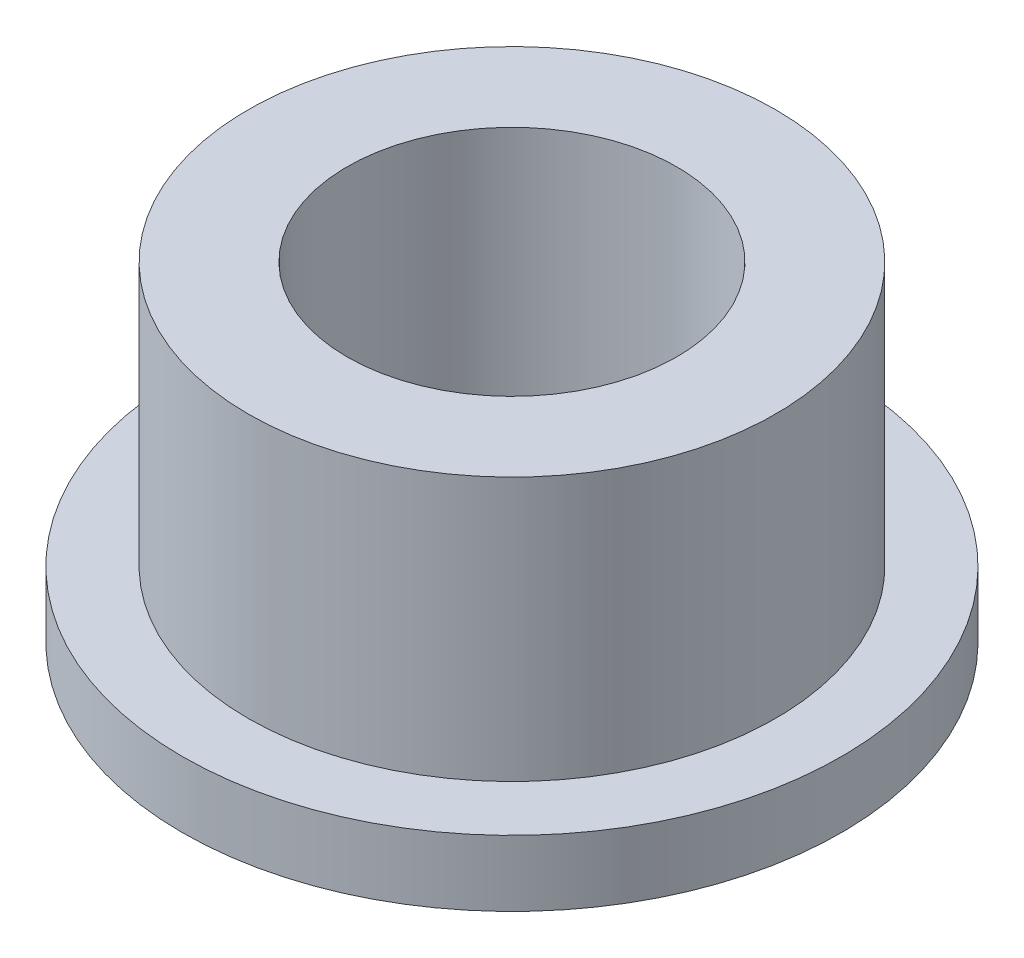
ISO-10303-21;
HEADER;
FILE_DESCRIPTION(('STEP AP214'),'2;1');
FILE_NAME('part.step','',(''),(''),'','','');
FILE_SCHEMA(('AUTOMOTIVE_DESIGN { 1 0 10303 214 1 1 1 1 }'));
ENDSEC;
DATA;
#1=APPLICATION_CONTEXT('core data for automotive mechanical design processes');
#2=APPLICATION_PROTOCOL_DEFINITION('international standard','automotive_design',2000,#1);
#3=PRODUCT_CONTEXT('',#1,'mechanical');
#4=PRODUCT('Part','Part','',(#3));
#5=PRODUCT_RELATED_PRODUCT_CATEGORY('part','',(#4));
#6=PRODUCT_DEFINITION_FORMATION('','',#4);
#7=PRODUCT_DEFINITION_CONTEXT('part definition',#1,'design');
#8=PRODUCT_DEFINITION('design','',#6,#7);
#9=PRODUCT_DEFINITION_SHAPE('','',#8);
#10=(LENGTH_UNIT() NAMED_UNIT(*) SI_UNIT(.MILLI.,.METRE.));
#11=(NAMED_UNIT(*) PLANE_ANGLE_UNIT() SI_UNIT($,.RADIAN.));
#12=(NAMED_UNIT(*) SI_UNIT($,.STERADIAN.) SOLID_ANGLE_UNIT());
#13=UNCERTAINTY_MEASURE_WITH_UNIT(LENGTH_MEASURE(1.E-05),#10,'distance_accuracy_value','');
#14=(GEOMETRIC_REPRESENTATION_CONTEXT(3) GLOBAL_UNCERTAINTY_ASSIGNED_CONTEXT((#13)) GLOBAL_UNIT_ASSIGNED_CONTEXT((#10,
#11,#12)) REPRESENTATION_CONTEXT('',''));
#15=CARTESIAN_POINT('',(0.,0.,0.));
#16=DIRECTION('',(0.,0.,1.));
#17=DIRECTION('',(1.,0.,0.));
#18=AXIS2_PLACEMENT_3D('',#15,#16,#17);
#19=CARTESIAN_POINT('',(0.,1.,0.));
#20=DIRECTION('',(0.,-1.,0.));
#21=DIRECTION('',(0.,0.,-1.));
#22=AXIS2_PLACEMENT_3D('',#19,#20,#21);
#23=CYLINDRICAL_SURFACE('',#22,5.);
#24=CARTESIAN_POINT('',(0.,1.,0.));
#25=DIRECTION('',(0.,1.,0.));
#26=DIRECTION('',(0.,0.,1.));
#27=AXIS2_PLACEMENT_3D('',#24,#25,#26);
#28=CIRCLE('',#27,5.);
#29=CARTESIAN_POINT('',(0.,1.,5.));
#30=VERTEX_POINT('',#29);
#31=EDGE_CURVE('E47',#30,#30,#28,.T.);
#32=ORIENTED_EDGE('',*,*,#31,.F.);
#33=EDGE_LOOP('',(#32));
#34=FACE_BOUND('',#33,.T.);
#35=CARTESIAN_POINT('',(0.,0.,0.));
#36=DIRECTION('',(0.,1.,0.));
#37=DIRECTION('',(0.,0.,1.));
#38=AXIS2_PLACEMENT_3D('',#35,#36,#37);
#39=CIRCLE('',#38,5.);
#40=CARTESIAN_POINT('',(0.,0.,5.));
#41=VERTEX_POINT('',#40);
#42=EDGE_CURVE('E52',#41,#41,#39,.T.);
#43=ORIENTED_EDGE('',*,*,#42,.T.);
#44=EDGE_LOOP('',(#43));
#45=FACE_BOUND('',#44,.T.);
#46=ADVANCED_FACE('F40',(#34,#45),#23,.T.);
#47=CARTESIAN_POINT('',(0.,1.,0.));
#48=DIRECTION('',(0.,1.,0.));
#49=DIRECTION('',(0.,0.,1.));
#50=AXIS2_PLACEMENT_3D('',#47,#48,#49);
#51=PLANE('',#50);
#52=CARTESIAN_POINT('',(0.,1.,0.));
#53=DIRECTION('',(0.,1.,0.));
#54=DIRECTION('',(0.,0.,1.));
#55=AXIS2_PLACEMENT_3D('',#52,#53,#54);
#56=CIRCLE('',#55,4.);
#57=CARTESIAN_POINT('',(0.,1.,4.));
#58=VERTEX_POINT('',#57);
#59=EDGE_CURVE('E10',#58,#58,#56,.T.);
#60=ORIENTED_EDGE('',*,*,#59,.F.);
#61=EDGE_LOOP('',(#60));
#62=FACE_BOUND('',#61,.T.);
#63=ORIENTED_EDGE('',*,*,#31,.T.);
#64=EDGE_LOOP('',(#63));
#65=FACE_BOUND('',#64,.T.);
#66=ADVANCED_FACE('F93',(#62,#65),#51,.T.);
#67=CARTESIAN_POINT('',(0.,0.,0.));
#68=DIRECTION('',(0.,1.,0.));
#69=DIRECTION('',(0.,0.,1.));
#70=AXIS2_PLACEMENT_3D('',#67,#68,#69);
#71=PLANE('',#70);
#72=CARTESIAN_POINT('',(0.,0.,0.));
#73=DIRECTION('',(0.,-1.,0.));
#74=DIRECTION('',(0.,0.,-1.));
#75=AXIS2_PLACEMENT_3D('',#72,#73,#74);
#76=CIRCLE('',#75,1.5);
#77=CARTESIAN_POINT('',(0.,0.,-1.5));
#78=VERTEX_POINT('',#77);
#79=EDGE_CURVE('E71',#78,#78,#76,.T.);
#80=ORIENTED_EDGE('',*,*,#79,.F.);
#81=EDGE_LOOP('',(#80));
#82=FACE_BOUND('',#81,.T.);
#83=ORIENTED_EDGE('',*,*,#42,.F.);
#84=EDGE_LOOP('',(#83));
#85=FACE_BOUND('',#84,.T.);
#86=ADVANCED_FACE('F98',(#82,#85),#71,.F.);
#87=CARTESIAN_POINT('',(0.,5.,0.));
#88=DIRECTION('',(0.,-1.,0.));
#89=DIRECTION('',(0.,0.,-1.));
#90=AXIS2_PLACEMENT_3D('',#87,#88,#89);
#91=CYLINDRICAL_SURFACE('',#90,4.);
#92=CARTESIAN_POINT('',(0.,5.,0.));
#93=DIRECTION('',(0.,1.,0.));
#94=DIRECTION('',(0.,0.,1.));
#95=AXIS2_PLACEMENT_3D('',#92,#93,#94);
#96=CIRCLE('',#95,4.);
#97=CARTESIAN_POINT('',(0.,5.,4.));
#98=VERTEX_POINT('',#97);
#99=EDGE_CURVE('E55',#98,#98,#96,.T.);
#100=ORIENTED_EDGE('',*,*,#99,.F.);
#101=EDGE_LOOP('',(#100));
#102=FACE_BOUND('',#101,.T.);
#103=ORIENTED_EDGE('',*,*,#59,.T.);
#104=EDGE_LOOP('',(#103));
#105=FACE_BOUND('',#104,.T.);
#106=ADVANCED_FACE('F106',(#102,#105),#91,.T.);
#107=CARTESIAN_POINT('',(0.,5.,0.));
#108=DIRECTION('',(0.,1.,0.));
#109=DIRECTION('',(0.,0.,1.));
#110=AXIS2_PLACEMENT_3D('',#107,#108,#109);
#111=PLANE('',#110);
#112=CARTESIAN_POINT('',(0.,5.,0.));
#113=DIRECTION('',(0.,1.,0.));
#114=DIRECTION('',(0.,0.,1.));
#115=AXIS2_PLACEMENT_3D('',#112,#113,#114);
#116=CIRCLE('',#115,2.5);
#117=CARTESIAN_POINT('',(0.,5.,2.5));
#118=VERTEX_POINT('',#117);
#119=EDGE_CURVE('E65',#118,#118,#116,.T.);
#120=ORIENTED_EDGE('',*,*,#119,.F.);
#121=EDGE_LOOP('',(#120));
#122=FACE_BOUND('',#121,.T.);
#123=ORIENTED_EDGE('',*,*,#99,.T.);
#124=EDGE_LOOP('',(#123));
#125=FACE_BOUND('',#124,.T.);
#126=ADVANCED_FACE('F89',(#122,#125),#111,.T.);
#127=CARTESIAN_POINT('',(0.,1.,0.));
#128=DIRECTION('',(0.,1.,0.));
#129=DIRECTION('',(0.,0.,1.));
#130=AXIS2_PLACEMENT_3D('',#127,#128,#129);
#131=CYLINDRICAL_SURFACE('',#130,2.5);
#132=CARTESIAN_POINT('',(0.,1.,0.));
#133=DIRECTION('',(0.,1.,0.));
#134=DIRECTION('',(0.,0.,1.));
#135=AXIS2_PLACEMENT_3D('',#132,#133,#134);
#136=CIRCLE('',#135,2.5);
#137=CARTESIAN_POINT('',(0.,1.,2.5));
#138=VERTEX_POINT('',#137);
#139=EDGE_CURVE('E61',#138,#138,#136,.T.);
#140=ORIENTED_EDGE('',*,*,#139,.F.);
#141=EDGE_LOOP('',(#140));
#142=FACE_BOUND('',#141,.T.);
#143=ORIENTED_EDGE('',*,*,#119,.T.);
#144=EDGE_LOOP('',(#143));
#145=FACE_BOUND('',#144,.T.);
#146=ADVANCED_FACE('F82',(#142,#145),#131,.F.);
#147=CARTESIAN_POINT('',(0.,1.,0.));
#148=DIRECTION('',(0.,1.,0.));
#149=DIRECTION('',(0.,0.,1.));
#150=AXIS2_PLACEMENT_3D('',#147,#148,#149);
#151=PLANE('',#150);
#152=CARTESIAN_POINT('',(0.,0.999999999999999,0.));
#153=DIRECTION('',(0.,1.,0.));
#154=DIRECTION('',(0.,0.,1.));
#155=AXIS2_PLACEMENT_3D('',#152,#153,#154);
#156=CIRCLE('',#155,1.5);
#157=CARTESIAN_POINT('',(0.,0.999999999999999,1.5));
#158=VERTEX_POINT('',#157);
#159=EDGE_CURVE('E43',#158,#158,#156,.T.);
#160=ORIENTED_EDGE('',*,*,#159,.F.);
#161=EDGE_LOOP('',(#160));
#162=FACE_BOUND('',#161,.T.);
#163=ORIENTED_EDGE('',*,*,#139,.T.);
#164=EDGE_LOOP('',(#163));
#165=FACE_BOUND('',#164,.T.);
#166=ADVANCED_FACE('F80',(#162,#165),#151,.T.);
#167=CARTESIAN_POINT('',(0.,10.,0.));
#168=DIRECTION('',(0.,-1.,0.));
#169=DIRECTION('',(0.,0.,-1.));
#170=AXIS2_PLACEMENT_3D('',#167,#168,#169);
#171=CYLINDRICAL_SURFACE('',#170,1.5);
#172=ORIENTED_EDGE('',*,*,#159,.T.);
#173=EDGE_LOOP('',(#172));
#174=FACE_BOUND('',#173,.T.);
#175=ORIENTED_EDGE('',*,*,#79,.T.);
#176=EDGE_LOOP('',(#175));
#177=FACE_BOUND('',#176,.T.);
#178=ADVANCED_FACE('F78',(#174,#177),#171,.F.);
#179=CLOSED_SHELL('',(#46,#66,#86,#106,#126,#146,#166,#178));
#180=MANIFOLD_SOLID_BREP('B2',#179);
#181=ADVANCED_BREP_SHAPE_REPRESENTATION('',(#18,#180),#14);
#182=SHAPE_DEFINITION_REPRESENTATION(#9,#181);
ENDSEC;
END-ISO-10303-21;
